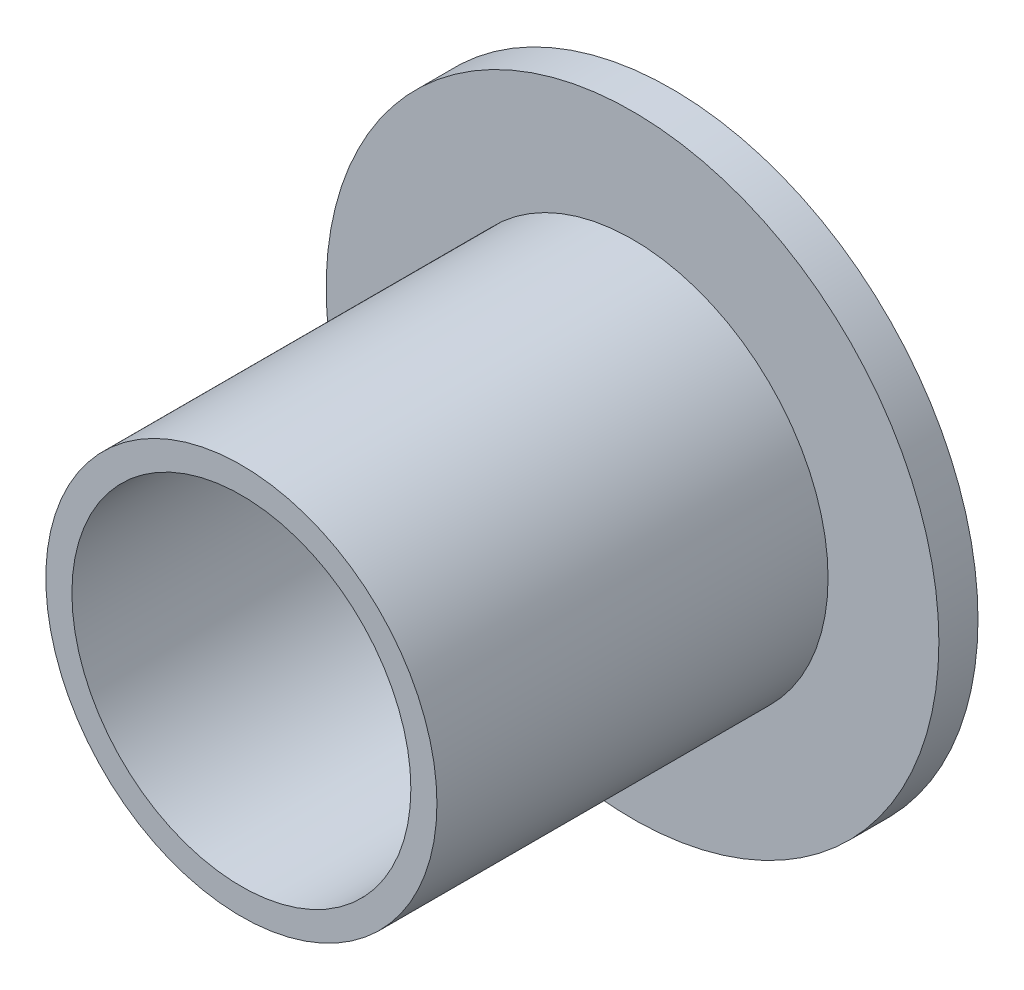
ISO-10303-21;
HEADER;
FILE_DESCRIPTION(('STEP AP214'),'2;1');
FILE_NAME('part.step','',(''),(''),'','','');
FILE_SCHEMA(('AUTOMOTIVE_DESIGN { 1 0 10303 214 1 1 1 1 }'));
ENDSEC;
DATA;
#1=APPLICATION_CONTEXT('core data for automotive mechanical design processes');
#2=APPLICATION_PROTOCOL_DEFINITION('international standard','automotive_design',2000,#1);
#3=PRODUCT_CONTEXT('',#1,'mechanical');
#4=PRODUCT('Part','Part','',(#3));
#5=PRODUCT_RELATED_PRODUCT_CATEGORY('part','',(#4));
#6=PRODUCT_DEFINITION_FORMATION('','',#4);
#7=PRODUCT_DEFINITION_CONTEXT('part definition',#1,'design');
#8=PRODUCT_DEFINITION('design','',#6,#7);
#9=PRODUCT_DEFINITION_SHAPE('','',#8);
#10=(LENGTH_UNIT() NAMED_UNIT(*) SI_UNIT(.MILLI.,.METRE.));
#11=(NAMED_UNIT(*) PLANE_ANGLE_UNIT() SI_UNIT($,.RADIAN.));
#12=(NAMED_UNIT(*) SI_UNIT($,.STERADIAN.) SOLID_ANGLE_UNIT());
#13=UNCERTAINTY_MEASURE_WITH_UNIT(LENGTH_MEASURE(1.E-05),#10,'distance_accuracy_value','');
#14=(GEOMETRIC_REPRESENTATION_CONTEXT(3) GLOBAL_UNCERTAINTY_ASSIGNED_CONTEXT((#13)) GLOBAL_UNIT_ASSIGNED_CONTEXT((#10,
#11,#12)) REPRESENTATION_CONTEXT('',''));
#15=CARTESIAN_POINT('',(0.,0.,0.));
#16=DIRECTION('',(0.,0.,1.));
#17=DIRECTION('',(1.,0.,0.));
#18=AXIS2_PLACEMENT_3D('',#15,#16,#17);
#19=CARTESIAN_POINT('',(0.,0.,3.));
#20=DIRECTION('',(0.,0.,-1.));
#21=DIRECTION('',(-1.,0.,0.));
#22=AXIS2_PLACEMENT_3D('',#19,#20,#21);
#23=CYLINDRICAL_SURFACE('',#22,23.5);
#24=CARTESIAN_POINT('',(0.,0.,3.));
#25=DIRECTION('',(0.,0.,1.));
#26=DIRECTION('',(1.,0.,0.));
#27=AXIS2_PLACEMENT_3D('',#24,#25,#26);
#28=CIRCLE('',#27,23.5);
#29=CARTESIAN_POINT('',(23.5,0.,3.));
#30=VERTEX_POINT('',#29);
#31=EDGE_CURVE('E45',#30,#30,#28,.T.);
#32=ORIENTED_EDGE('',*,*,#31,.F.);
#33=EDGE_LOOP('',(#32));
#34=FACE_BOUND('',#33,.T.);
#35=CARTESIAN_POINT('',(0.,0.,0.));
#36=DIRECTION('',(0.,0.,1.));
#37=DIRECTION('',(1.,0.,0.));
#38=AXIS2_PLACEMENT_3D('',#35,#36,#37);
#39=CIRCLE('',#38,23.5);
#40=CARTESIAN_POINT('',(23.5,0.,0.));
#41=VERTEX_POINT('',#40);
#42=EDGE_CURVE('E40',#41,#41,#39,.T.);
#43=ORIENTED_EDGE('',*,*,#42,.T.);
#44=EDGE_LOOP('',(#43));
#45=FACE_BOUND('',#44,.T.);
#46=ADVANCED_FACE('F37',(#34,#45),#23,.T.);
#47=CARTESIAN_POINT('',(0.,0.,3.));
#48=DIRECTION('',(0.,0.,1.));
#49=DIRECTION('',(1.,0.,0.));
#50=AXIS2_PLACEMENT_3D('',#47,#48,#49);
#51=PLANE('',#50);
#52=CARTESIAN_POINT('',(0.,0.,3.));
#53=DIRECTION('',(0.,0.,1.));
#54=DIRECTION('',(1.,0.,0.));
#55=AXIS2_PLACEMENT_3D('',#52,#53,#54);
#56=CIRCLE('',#55,15.);
#57=CARTESIAN_POINT('',(15.,0.,3.));
#58=VERTEX_POINT('',#57);
#59=EDGE_CURVE('E10',#58,#58,#56,.T.);
#60=ORIENTED_EDGE('',*,*,#59,.F.);
#61=EDGE_LOOP('',(#60));
#62=FACE_BOUND('',#61,.T.);
#63=ORIENTED_EDGE('',*,*,#31,.T.);
#64=EDGE_LOOP('',(#63));
#65=FACE_BOUND('',#64,.T.);
#66=ADVANCED_FACE('F86',(#62,#65),#51,.T.);
#67=CARTESIAN_POINT('',(0.,0.,0.));
#68=DIRECTION('',(0.,0.,1.));
#69=DIRECTION('',(1.,0.,0.));
#70=AXIS2_PLACEMENT_3D('',#67,#68,#69);
#71=PLANE('',#70);
#72=CARTESIAN_POINT('',(0.,0.,0.));
#73=DIRECTION('',(0.,0.,1.));
#74=DIRECTION('',(1.,0.,0.));
#75=AXIS2_PLACEMENT_3D('',#72,#73,#74);
#76=CIRCLE('',#75,13.);
#77=CARTESIAN_POINT('',(13.,0.,0.));
#78=VERTEX_POINT('',#77);
#79=EDGE_CURVE('E56',#78,#78,#76,.T.);
#80=ORIENTED_EDGE('',*,*,#79,.T.);
#81=EDGE_LOOP('',(#80));
#82=FACE_BOUND('',#81,.T.);
#83=ORIENTED_EDGE('',*,*,#42,.F.);
#84=EDGE_LOOP('',(#83));
#85=FACE_BOUND('',#84,.T.);
#86=ADVANCED_FACE('F65',(#82,#85),#71,.F.);
#87=CARTESIAN_POINT('',(0.,0.,33.));
#88=DIRECTION('',(0.,0.,-1.));
#89=DIRECTION('',(-1.,0.,0.));
#90=AXIS2_PLACEMENT_3D('',#87,#88,#89);
#91=CYLINDRICAL_SURFACE('',#90,15.);
#92=CARTESIAN_POINT('',(0.,0.,33.));
#93=DIRECTION('',(0.,0.,1.));
#94=DIRECTION('',(1.,0.,0.));
#95=AXIS2_PLACEMENT_3D('',#92,#93,#94);
#96=CIRCLE('',#95,15.);
#97=CARTESIAN_POINT('',(15.,0.,33.));
#98=VERTEX_POINT('',#97);
#99=EDGE_CURVE('E52',#98,#98,#96,.T.);
#100=ORIENTED_EDGE('',*,*,#99,.F.);
#101=EDGE_LOOP('',(#100));
#102=FACE_BOUND('',#101,.T.);
#103=ORIENTED_EDGE('',*,*,#59,.T.);
#104=EDGE_LOOP('',(#103));
#105=FACE_BOUND('',#104,.T.);
#106=ADVANCED_FACE('F77',(#102,#105),#91,.T.);
#107=CARTESIAN_POINT('',(0.,0.,33.));
#108=DIRECTION('',(0.,0.,1.));
#109=DIRECTION('',(1.,0.,0.));
#110=AXIS2_PLACEMENT_3D('',#107,#108,#109);
#111=PLANE('',#110);
#112=CARTESIAN_POINT('',(0.,0.,33.));
#113=DIRECTION('',(0.,0.,1.));
#114=DIRECTION('',(1.,0.,0.));
#115=AXIS2_PLACEMENT_3D('',#112,#113,#114);
#116=CIRCLE('',#115,13.);
#117=CARTESIAN_POINT('',(13.,0.,33.));
#118=VERTEX_POINT('',#117);
#119=EDGE_CURVE('E57',#118,#118,#116,.T.);
#120=ORIENTED_EDGE('',*,*,#119,.F.);
#121=EDGE_LOOP('',(#120));
#122=FACE_BOUND('',#121,.T.);
#123=ORIENTED_EDGE('',*,*,#99,.T.);
#124=EDGE_LOOP('',(#123));
#125=FACE_BOUND('',#124,.T.);
#126=ADVANCED_FACE('F71',(#122,#125),#111,.T.);
#127=CARTESIAN_POINT('',(0.,0.,0.));
#128=DIRECTION('',(0.,0.,1.));
#129=DIRECTION('',(1.,0.,0.));
#130=AXIS2_PLACEMENT_3D('',#127,#128,#129);
#131=CYLINDRICAL_SURFACE('',#130,13.);
#132=ORIENTED_EDGE('',*,*,#79,.F.);
#133=EDGE_LOOP('',(#132));
#134=FACE_BOUND('',#133,.T.);
#135=ORIENTED_EDGE('',*,*,#119,.T.);
#136=EDGE_LOOP('',(#135));
#137=FACE_BOUND('',#136,.T.);
#138=ADVANCED_FACE('F68',(#134,#137),#131,.F.);
#139=CLOSED_SHELL('',(#46,#66,#86,#106,#126,#138));
#140=MANIFOLD_SOLID_BREP('B2',#139);
#141=ADVANCED_BREP_SHAPE_REPRESENTATION('',(#18,#140),#14);
#142=SHAPE_DEFINITION_REPRESENTATION(#9,#141);
ENDSEC;
END-ISO-10303-21;
